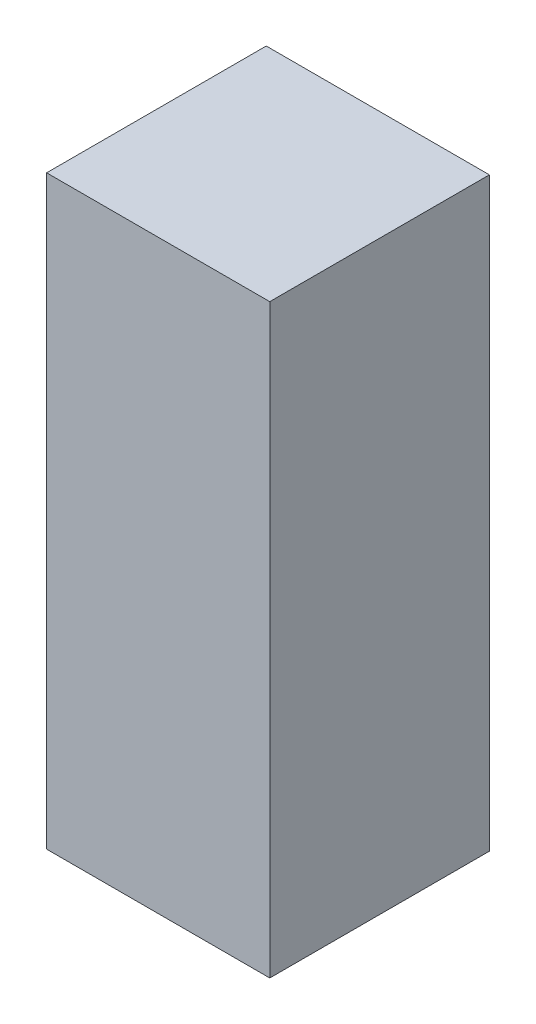
ISO-10303-21;
HEADER;
FILE_DESCRIPTION(('STEP AP214'),'2;1');
FILE_NAME('part.step','',(''),(''),'','','');
FILE_SCHEMA(('AUTOMOTIVE_DESIGN { 1 0 10303 214 1 1 1 1 }'));
ENDSEC;
DATA;
#1=APPLICATION_CONTEXT('core data for automotive mechanical design processes');
#2=APPLICATION_PROTOCOL_DEFINITION('international standard','automotive_design',2000,#1);
#3=PRODUCT_CONTEXT('',#1,'mechanical');
#4=PRODUCT('Part','Part','',(#3));
#5=PRODUCT_RELATED_PRODUCT_CATEGORY('part','',(#4));
#6=PRODUCT_DEFINITION_FORMATION('','',#4);
#7=PRODUCT_DEFINITION_CONTEXT('part definition',#1,'design');
#8=PRODUCT_DEFINITION('design','',#6,#7);
#9=PRODUCT_DEFINITION_SHAPE('','',#8);
#10=(LENGTH_UNIT() NAMED_UNIT(*) SI_UNIT(.MILLI.,.METRE.));
#11=(NAMED_UNIT(*) PLANE_ANGLE_UNIT() SI_UNIT($,.RADIAN.));
#12=(NAMED_UNIT(*) SI_UNIT($,.STERADIAN.) SOLID_ANGLE_UNIT());
#13=UNCERTAINTY_MEASURE_WITH_UNIT(LENGTH_MEASURE(1.E-05),#10,'distance_accuracy_value','');
#14=(GEOMETRIC_REPRESENTATION_CONTEXT(3) GLOBAL_UNCERTAINTY_ASSIGNED_CONTEXT((#13)) GLOBAL_UNIT_ASSIGNED_CONTEXT((#10,
#11,#12)) REPRESENTATION_CONTEXT('',''));
#15=CARTESIAN_POINT('',(0.,0.,0.));
#16=DIRECTION('',(0.,0.,1.));
#17=DIRECTION('',(1.,0.,0.));
#18=AXIS2_PLACEMENT_3D('',#15,#16,#17);
#19=CARTESIAN_POINT('',(-1.016,2.667,2.00000108));
#20=DIRECTION('',(0.,0.,1.));
#21=DIRECTION('',(1.,0.,0.));
#22=AXIS2_PLACEMENT_3D('',#19,#20,#21);
#23=PLANE('',#22);
#24=DIRECTION('',(0.,1.,0.));
#25=VECTOR('',#24,1.);
#26=CARTESIAN_POINT('',(-1.016,-2.667,2.00000108));
#27=LINE('',#26,#25);
#28=CARTESIAN_POINT('',(-1.016,-2.667,2.00000108));
#29=VERTEX_POINT('',#28);
#30=CARTESIAN_POINT('',(-1.016,2.667,2.00000108));
#31=VERTEX_POINT('',#30);
#32=EDGE_CURVE('E27',#29,#31,#27,.T.);
#33=ORIENTED_EDGE('',*,*,#32,.F.);
#34=DIRECTION('',(-1.,0.,0.));
#35=VECTOR('',#34,1.);
#36=CARTESIAN_POINT('',(1.016,-2.667,2.00000108));
#37=LINE('',#36,#35);
#38=CARTESIAN_POINT('',(1.016,-2.667,2.00000108));
#39=VERTEX_POINT('',#38);
#40=EDGE_CURVE('E71',#39,#29,#37,.T.);
#41=ORIENTED_EDGE('',*,*,#40,.F.);
#42=DIRECTION('',(0.,-1.,0.));
#43=VECTOR('',#42,1.);
#44=CARTESIAN_POINT('',(1.016,2.667,2.00000108));
#45=LINE('',#44,#43);
#46=CARTESIAN_POINT('',(1.016,2.667,2.00000108));
#47=VERTEX_POINT('',#46);
#48=EDGE_CURVE('E94',#47,#39,#45,.T.);
#49=ORIENTED_EDGE('',*,*,#48,.F.);
#50=DIRECTION('',(1.,0.,0.));
#51=VECTOR('',#50,1.);
#52=CARTESIAN_POINT('',(-1.016,2.667,2.00000108));
#53=LINE('',#52,#51);
#54=EDGE_CURVE('E106',#31,#47,#53,.T.);
#55=ORIENTED_EDGE('',*,*,#54,.F.);
#56=EDGE_LOOP('',(#33,#41,#49,#55));
#57=FACE_BOUND('',#56,.T.);
#58=ADVANCED_FACE('F16',(#57),#23,.T.);
#59=CARTESIAN_POINT('',(-1.016,2.667,0.));
#60=DIRECTION('',(0.,0.,1.));
#61=DIRECTION('',(1.,0.,0.));
#62=AXIS2_PLACEMENT_3D('',#59,#60,#61);
#63=PLANE('',#62);
#64=DIRECTION('',(1.,0.,0.));
#65=VECTOR('',#64,1.);
#66=CARTESIAN_POINT('',(-1.016,2.667,0.));
#67=LINE('',#66,#65);
#68=CARTESIAN_POINT('',(-1.016,2.667,0.));
#69=VERTEX_POINT('',#68);
#70=CARTESIAN_POINT('',(1.016,2.667,0.));
#71=VERTEX_POINT('',#70);
#72=EDGE_CURVE('E89',#69,#71,#67,.T.);
#73=ORIENTED_EDGE('',*,*,#72,.T.);
#74=DIRECTION('',(0.,-1.,0.));
#75=VECTOR('',#74,1.);
#76=CARTESIAN_POINT('',(1.016,2.667,0.));
#77=LINE('',#76,#75);
#78=CARTESIAN_POINT('',(1.016,-2.667,0.));
#79=VERTEX_POINT('',#78);
#80=EDGE_CURVE('E64',#71,#79,#77,.T.);
#81=ORIENTED_EDGE('',*,*,#80,.T.);
#82=DIRECTION('',(-1.,0.,0.));
#83=VECTOR('',#82,1.);
#84=CARTESIAN_POINT('',(1.016,-2.667,0.));
#85=LINE('',#84,#83);
#86=CARTESIAN_POINT('',(-1.016,-2.667,0.));
#87=VERTEX_POINT('',#86);
#88=EDGE_CURVE('E79',#79,#87,#85,.T.);
#89=ORIENTED_EDGE('',*,*,#88,.T.);
#90=DIRECTION('',(0.,1.,0.));
#91=VECTOR('',#90,1.);
#92=CARTESIAN_POINT('',(-1.016,-2.667,0.));
#93=LINE('',#92,#91);
#94=EDGE_CURVE('E11',#87,#69,#93,.T.);
#95=ORIENTED_EDGE('',*,*,#94,.T.);
#96=EDGE_LOOP('',(#73,#81,#89,#95));
#97=FACE_BOUND('',#96,.T.);
#98=ADVANCED_FACE('F87',(#97),#63,.F.);
#99=CARTESIAN_POINT('',(-1.016,-2.667,0.));
#100=DIRECTION('',(-1.,0.,0.));
#101=DIRECTION('',(0.,0.,1.));
#102=AXIS2_PLACEMENT_3D('',#99,#100,#101);
#103=PLANE('',#102);
#104=DIRECTION('',(0.,0.,1.));
#105=VECTOR('',#104,1.);
#106=CARTESIAN_POINT('',(-1.016,-2.667,0.));
#107=LINE('',#106,#105);
#108=EDGE_CURVE('E83',#87,#29,#107,.T.);
#109=ORIENTED_EDGE('',*,*,#108,.T.);
#110=ORIENTED_EDGE('',*,*,#32,.T.);
#111=DIRECTION('',(0.,0.,1.));
#112=VECTOR('',#111,1.);
#113=CARTESIAN_POINT('',(-1.016,2.667,0.));
#114=LINE('',#113,#112);
#115=EDGE_CURVE('E20',#69,#31,#114,.T.);
#116=ORIENTED_EDGE('',*,*,#115,.F.);
#117=ORIENTED_EDGE('',*,*,#94,.F.);
#118=EDGE_LOOP('',(#109,#110,#116,#117));
#119=FACE_BOUND('',#118,.T.);
#120=ADVANCED_FACE('F119',(#119),#103,.T.);
#121=CARTESIAN_POINT('',(1.016,-2.667,0.));
#122=DIRECTION('',(0.,-1.,0.));
#123=DIRECTION('',(0.,0.,-1.));
#124=AXIS2_PLACEMENT_3D('',#121,#122,#123);
#125=PLANE('',#124);
#126=DIRECTION('',(0.,0.,1.));
#127=VECTOR('',#126,1.);
#128=CARTESIAN_POINT('',(1.016,-2.667,0.));
#129=LINE('',#128,#127);
#130=EDGE_CURVE('E81',#79,#39,#129,.T.);
#131=ORIENTED_EDGE('',*,*,#130,.T.);
#132=ORIENTED_EDGE('',*,*,#40,.T.);
#133=ORIENTED_EDGE('',*,*,#108,.F.);
#134=ORIENTED_EDGE('',*,*,#88,.F.);
#135=EDGE_LOOP('',(#131,#132,#133,#134));
#136=FACE_BOUND('',#135,.T.);
#137=ADVANCED_FACE('F80',(#136),#125,.T.);
#138=CARTESIAN_POINT('',(1.016,2.667,0.));
#139=DIRECTION('',(1.,0.,0.));
#140=DIRECTION('',(0.,1.,0.));
#141=AXIS2_PLACEMENT_3D('',#138,#139,#140);
#142=PLANE('',#141);
#143=DIRECTION('',(0.,0.,1.));
#144=VECTOR('',#143,1.);
#145=CARTESIAN_POINT('',(1.016,2.667,0.));
#146=LINE('',#145,#144);
#147=EDGE_CURVE('E103',#71,#47,#146,.T.);
#148=ORIENTED_EDGE('',*,*,#147,.T.);
#149=ORIENTED_EDGE('',*,*,#48,.T.);
#150=ORIENTED_EDGE('',*,*,#130,.F.);
#151=ORIENTED_EDGE('',*,*,#80,.F.);
#152=EDGE_LOOP('',(#148,#149,#150,#151));
#153=FACE_BOUND('',#152,.T.);
#154=ADVANCED_FACE('F93',(#153),#142,.T.);
#155=CARTESIAN_POINT('',(-1.016,2.667,0.));
#156=DIRECTION('',(0.,1.,0.));
#157=DIRECTION('',(1.,0.,0.));
#158=AXIS2_PLACEMENT_3D('',#155,#156,#157);
#159=PLANE('',#158);
#160=ORIENTED_EDGE('',*,*,#115,.T.);
#161=ORIENTED_EDGE('',*,*,#54,.T.);
#162=ORIENTED_EDGE('',*,*,#147,.F.);
#163=ORIENTED_EDGE('',*,*,#72,.F.);
#164=EDGE_LOOP('',(#160,#161,#162,#163));
#165=FACE_BOUND('',#164,.T.);
#166=ADVANCED_FACE('F18',(#165),#159,.T.);
#167=CLOSED_SHELL('',(#58,#98,#120,#137,#154,#166));
#168=MANIFOLD_SOLID_BREP('B1',#167);
#169=ADVANCED_BREP_SHAPE_REPRESENTATION('',(#18,#168),#14);
#170=SHAPE_DEFINITION_REPRESENTATION(#9,#169);
ENDSEC;
END-ISO-10303-21;
